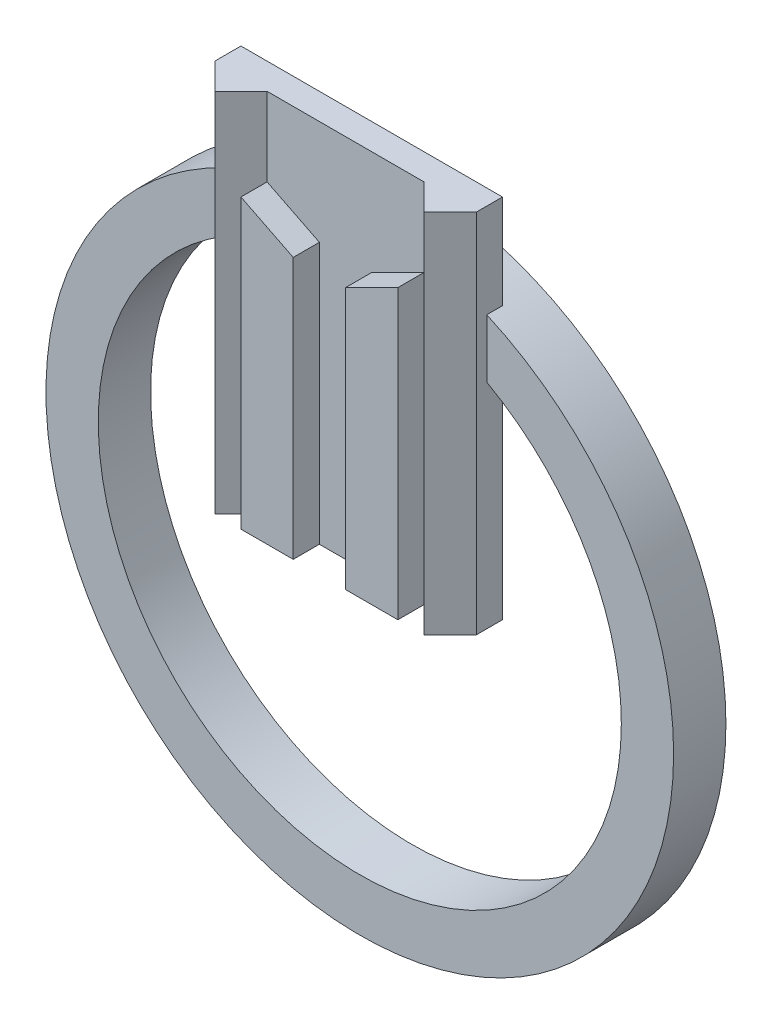
ISO-10303-21;
HEADER;
FILE_DESCRIPTION(('STEP AP214'),'2;1');
FILE_NAME('part.step','',(''),(''),'','','');
FILE_SCHEMA(('AUTOMOTIVE_DESIGN { 1 0 10303 214 1 1 1 1 }'));
ENDSEC;
DATA;
#1=APPLICATION_CONTEXT('core data for automotive mechanical design processes');
#2=APPLICATION_PROTOCOL_DEFINITION('international standard','automotive_design',2000,#1);
#3=PRODUCT_CONTEXT('',#1,'mechanical');
#4=PRODUCT('Part','Part','',(#3));
#5=PRODUCT_RELATED_PRODUCT_CATEGORY('part','',(#4));
#6=PRODUCT_DEFINITION_FORMATION('','',#4);
#7=PRODUCT_DEFINITION_CONTEXT('part definition',#1,'design');
#8=PRODUCT_DEFINITION('design','',#6,#7);
#9=PRODUCT_DEFINITION_SHAPE('','',#8);
#10=(LENGTH_UNIT() NAMED_UNIT(*) SI_UNIT(.MILLI.,.METRE.));
#11=(NAMED_UNIT(*) PLANE_ANGLE_UNIT() SI_UNIT($,.RADIAN.));
#12=(NAMED_UNIT(*) SI_UNIT($,.STERADIAN.) SOLID_ANGLE_UNIT());
#13=UNCERTAINTY_MEASURE_WITH_UNIT(LENGTH_MEASURE(1.E-05),#10,'distance_accuracy_value','');
#14=(GEOMETRIC_REPRESENTATION_CONTEXT(3) GLOBAL_UNCERTAINTY_ASSIGNED_CONTEXT((#13)) GLOBAL_UNIT_ASSIGNED_CONTEXT((#10,
#11,#12)) REPRESENTATION_CONTEXT('',''));
#15=CARTESIAN_POINT('',(0.,0.,0.));
#16=DIRECTION('',(0.,0.,1.));
#17=DIRECTION('',(1.,0.,0.));
#18=AXIS2_PLACEMENT_3D('',#15,#16,#17);
#19=CARTESIAN_POINT('',(0.,0.,0.));
#20=DIRECTION('',(0.,0.,1.));
#21=DIRECTION('',(1.,0.,0.));
#22=AXIS2_PLACEMENT_3D('',#19,#20,#21);
#23=PLANE('',#22);
#24=CARTESIAN_POINT('',(0.724382211705635,-37.8670558698346,0.));
#25=DIRECTION('',(0.,0.,1.));
#26=DIRECTION('',(1.,0.,0.));
#27=AXIS2_PLACEMENT_3D('',#24,#25,#26);
#28=CIRCLE('',#27,50.);
#29=CARTESIAN_POINT('',(25.,5.84443439298587,0.));
#30=VERTEX_POINT('',#29);
#31=CARTESIAN_POINT('',(-25.,5.00783374898642,0.));
#32=VERTEX_POINT('',#31);
#33=EDGE_CURVE('E164',#30,#32,#28,.T.);
#34=ORIENTED_EDGE('',*,*,#33,.F.);
#35=DIRECTION('',(0.,1.,0.));
#36=VECTOR('',#35,1.);
#37=CARTESIAN_POINT('',(25.,35.,0.));
#38=LINE('',#37,#36);
#39=CARTESIAN_POINT('',(25.,-35.,0.));
#40=VERTEX_POINT('',#39);
#41=EDGE_CURVE('E231',#40,#30,#38,.T.);
#42=ORIENTED_EDGE('',*,*,#41,.F.);
#43=DIRECTION('',(1.,0.,0.));
#44=VECTOR('',#43,1.);
#45=CARTESIAN_POINT('',(-25.,-35.,0.));
#46=LINE('',#45,#44);
#47=CARTESIAN_POINT('',(-25.,-35.,0.));
#48=VERTEX_POINT('',#47);
#49=EDGE_CURVE('E166',#48,#40,#46,.T.);
#50=ORIENTED_EDGE('',*,*,#49,.F.);
#51=DIRECTION('',(0.,-1.,0.));
#52=VECTOR('',#51,1.);
#53=CARTESIAN_POINT('',(-25.,35.,0.));
#54=LINE('',#53,#52);
#55=EDGE_CURVE('E160',#32,#48,#54,.T.);
#56=ORIENTED_EDGE('',*,*,#55,.F.);
#57=EDGE_LOOP('',(#34,#42,#50,#56));
#58=FACE_BOUND('',#57,.T.);
#59=ADVANCED_FACE('F32',(#58),#23,.F.);
#60=CARTESIAN_POINT('',(0.,0.,5.));
#61=DIRECTION('',(0.,0.,1.));
#62=DIRECTION('',(1.,0.,0.));
#63=AXIS2_PLACEMENT_3D('',#60,#61,#62);
#64=PLANE('',#63);
#65=DIRECTION('',(0.,-1.,0.));
#66=VECTOR('',#65,1.);
#67=CARTESIAN_POINT('',(5.,-35.,5.));
#68=LINE('',#67,#66);
#69=CARTESIAN_POINT('',(5.,15.,5.));
#70=VERTEX_POINT('',#69);
#71=CARTESIAN_POINT('',(5.,-35.,5.));
#72=VERTEX_POINT('',#71);
#73=EDGE_CURVE('E281',#70,#72,#68,.T.);
#74=ORIENTED_EDGE('',*,*,#73,.F.);
#75=DIRECTION('',(-0.894427190999916,-0.447213595499958,0.));
#76=VECTOR('',#75,1.);
#77=CARTESIAN_POINT('',(5.,15.,5.));
#78=LINE('',#77,#76);
#79=CARTESIAN_POINT('',(15.,20.,5.));
#80=VERTEX_POINT('',#79);
#81=EDGE_CURVE('E283',#80,#70,#78,.T.);
#82=ORIENTED_EDGE('',*,*,#81,.F.);
#83=DIRECTION('',(0.,-1.,0.));
#84=VECTOR('',#83,1.);
#85=CARTESIAN_POINT('',(15.,35.,5.));
#86=LINE('',#85,#84);
#87=CARTESIAN_POINT('',(15.,35.,5.));
#88=VERTEX_POINT('',#87);
#89=EDGE_CURVE('E206',#88,#80,#86,.T.);
#90=ORIENTED_EDGE('',*,*,#89,.F.);
#91=DIRECTION('',(-1.,0.,0.));
#92=VECTOR('',#91,1.);
#93=CARTESIAN_POINT('',(-25.,35.,5.));
#94=LINE('',#93,#92);
#95=CARTESIAN_POINT('',(-15.,35.,5.));
#96=VERTEX_POINT('',#95);
#97=EDGE_CURVE('E227',#88,#96,#94,.T.);
#98=ORIENTED_EDGE('',*,*,#97,.T.);
#99=DIRECTION('',(0.,1.,0.));
#100=VECTOR('',#99,1.);
#101=CARTESIAN_POINT('',(-15.,35.,5.));
#102=LINE('',#101,#100);
#103=CARTESIAN_POINT('',(-15.,20.,5.));
#104=VERTEX_POINT('',#103);
#105=EDGE_CURVE('E241',#104,#96,#102,.T.);
#106=ORIENTED_EDGE('',*,*,#105,.F.);
#107=DIRECTION('',(-0.894427190999916,0.447213595499958,0.));
#108=VECTOR('',#107,1.);
#109=CARTESIAN_POINT('',(-4.99999999999999,15.,5.));
#110=LINE('',#109,#108);
#111=CARTESIAN_POINT('',(-4.99999999999999,15.,5.));
#112=VERTEX_POINT('',#111);
#113=EDGE_CURVE('E254',#112,#104,#110,.T.);
#114=ORIENTED_EDGE('',*,*,#113,.F.);
#115=DIRECTION('',(0.,1.,0.));
#116=VECTOR('',#115,1.);
#117=CARTESIAN_POINT('',(-4.99999999999999,-35.,5.));
#118=LINE('',#117,#116);
#119=CARTESIAN_POINT('',(-4.99999999999999,-35.,5.));
#120=VERTEX_POINT('',#119);
#121=EDGE_CURVE('E258',#120,#112,#118,.T.);
#122=ORIENTED_EDGE('',*,*,#121,.F.);
#123=DIRECTION('',(1.,0.,0.));
#124=VECTOR('',#123,1.);
#125=CARTESIAN_POINT('',(-25.,-35.,5.));
#126=LINE('',#125,#124);
#127=EDGE_CURVE('E226',#120,#72,#126,.T.);
#128=ORIENTED_EDGE('',*,*,#127,.T.);
#129=EDGE_LOOP('',(#74,#82,#90,#98,#106,#114,#122,#128));
#130=FACE_BOUND('',#129,.T.);
#131=ADVANCED_FACE('F350',(#130),#64,.T.);
#132=CARTESIAN_POINT('',(25.,35.,5.));
#133=DIRECTION('',(-1.,0.,0.));
#134=DIRECTION('',(0.,-1.,0.));
#135=AXIS2_PLACEMENT_3D('',#132,#133,#134);
#136=PLANE('',#135);
#137=DIRECTION('',(0.,1.,0.));
#138=VECTOR('',#137,1.);
#139=CARTESIAN_POINT('',(25.,35.,3.));
#140=LINE('',#139,#138);
#141=CARTESIAN_POINT('',(25.,5.84443439298587,3.));
#142=VERTEX_POINT('',#141);
#143=CARTESIAN_POINT('',(25.,17.0027389265436,3.));
#144=VERTEX_POINT('',#143);
#145=EDGE_CURVE('E47',#142,#144,#140,.T.);
#146=ORIENTED_EDGE('',*,*,#145,.T.);
#147=DIRECTION('',(0.,0.,1.));
#148=VECTOR('',#147,1.);
#149=CARTESIAN_POINT('',(25.,17.0027389265436,-7.));
#150=LINE('',#149,#148);
#151=CARTESIAN_POINT('',(25.,17.0027389265436,0.));
#152=VERTEX_POINT('',#151);
#153=EDGE_CURVE('E294',#144,#152,#150,.F.);
#154=ORIENTED_EDGE('',*,*,#153,.T.);
#155=CARTESIAN_POINT('',(25.,35.,0.));
#156=VERTEX_POINT('',#155);
#157=EDGE_CURVE('E233',#152,#156,#38,.T.);
#158=ORIENTED_EDGE('',*,*,#157,.T.);
#159=DIRECTION('',(0.,0.,-1.));
#160=VECTOR('',#159,1.);
#161=CARTESIAN_POINT('',(25.,35.,5.));
#162=LINE('',#161,#160);
#163=CARTESIAN_POINT('',(25.,35.,4.99999999999996));
#164=VERTEX_POINT('',#163);
#165=EDGE_CURVE('E217',#164,#156,#162,.T.);
#166=ORIENTED_EDGE('',*,*,#165,.F.);
#167=DIRECTION('',(0.,-1.,0.));
#168=VECTOR('',#167,1.);
#169=CARTESIAN_POINT('',(25.,35.,4.99999999999996));
#170=LINE('',#169,#168);
#171=CARTESIAN_POINT('',(25.,-35.,4.99999999999996));
#172=VERTEX_POINT('',#171);
#173=EDGE_CURVE('E196',#164,#172,#170,.T.);
#174=ORIENTED_EDGE('',*,*,#173,.T.);
#175=DIRECTION('',(0.,0.,-1.));
#176=VECTOR('',#175,1.);
#177=CARTESIAN_POINT('',(25.,-35.,5.));
#178=LINE('',#177,#176);
#179=EDGE_CURVE('E224',#172,#40,#178,.T.);
#180=ORIENTED_EDGE('',*,*,#179,.T.);
#181=ORIENTED_EDGE('',*,*,#41,.T.);
#182=DIRECTION('',(0.,0.,1.));
#183=VECTOR('',#182,1.);
#184=CARTESIAN_POINT('',(25.,5.84443439298587,-7.));
#185=LINE('',#184,#183);
#186=EDGE_CURVE('E52',#142,#30,#185,.F.);
#187=ORIENTED_EDGE('',*,*,#186,.F.);
#188=EDGE_LOOP('',(#146,#154,#158,#166,#174,#180,#181,#187));
#189=FACE_BOUND('',#188,.T.);
#190=ADVANCED_FACE('F316',(#189),#136,.F.);
#191=CARTESIAN_POINT('',(-25.,35.,5.));
#192=DIRECTION('',(0.,-1.,0.));
#193=DIRECTION('',(0.,0.,-1.));
#194=AXIS2_PLACEMENT_3D('',#191,#192,#193);
#195=PLANE('',#194);
#196=DIRECTION('',(-0.707106781186546,0.,-0.707106781186549));
#197=VECTOR('',#196,1.);
#198=CARTESIAN_POINT('',(25.,35.,15.));
#199=LINE('',#198,#197);
#200=CARTESIAN_POINT('',(20.,35.,9.99999999999998));
#201=VERTEX_POINT('',#200);
#202=EDGE_CURVE('E201',#88,#201,#199,.F.);
#203=ORIENTED_EDGE('',*,*,#202,.T.);
#204=DIRECTION('',(-0.707106781186546,0.,0.707106781186549));
#205=VECTOR('',#204,1.);
#206=CARTESIAN_POINT('',(15.,35.,15.));
#207=LINE('',#206,#205);
#208=EDGE_CURVE('E199',#201,#164,#207,.F.);
#209=ORIENTED_EDGE('',*,*,#208,.T.);
#210=ORIENTED_EDGE('',*,*,#165,.T.);
#211=DIRECTION('',(-1.,0.,0.));
#212=VECTOR('',#211,1.);
#213=CARTESIAN_POINT('',(-25.,35.,0.));
#214=LINE('',#213,#212);
#215=CARTESIAN_POINT('',(-25.,35.,0.));
#216=VERTEX_POINT('',#215);
#217=EDGE_CURVE('E171',#156,#216,#214,.T.);
#218=ORIENTED_EDGE('',*,*,#217,.T.);
#219=DIRECTION('',(0.,0.,-1.));
#220=VECTOR('',#219,1.);
#221=CARTESIAN_POINT('',(-25.,35.,5.));
#222=LINE('',#221,#220);
#223=CARTESIAN_POINT('',(-25.,35.,4.99999999999997));
#224=VERTEX_POINT('',#223);
#225=EDGE_CURVE('E220',#224,#216,#222,.T.);
#226=ORIENTED_EDGE('',*,*,#225,.F.);
#227=DIRECTION('',(0.707106781186546,0.,0.707106781186549));
#228=VECTOR('',#227,1.);
#229=CARTESIAN_POINT('',(-15.,35.,15.));
#230=LINE('',#229,#228);
#231=CARTESIAN_POINT('',(-20.,35.,9.99999999999998));
#232=VERTEX_POINT('',#231);
#233=EDGE_CURVE('E215',#224,#232,#230,.T.);
#234=ORIENTED_EDGE('',*,*,#233,.T.);
#235=DIRECTION('',(0.707106781186546,0.,-0.707106781186549));
#236=VECTOR('',#235,1.);
#237=CARTESIAN_POINT('',(-25.,35.,15.));
#238=LINE('',#237,#236);
#239=EDGE_CURVE('E212',#232,#96,#238,.T.);
#240=ORIENTED_EDGE('',*,*,#239,.T.);
#241=ORIENTED_EDGE('',*,*,#97,.F.);
#242=EDGE_LOOP('',(#203,#209,#210,#218,#226,#234,#240,#241));
#243=FACE_BOUND('',#242,.T.);
#244=ADVANCED_FACE('F324',(#243),#195,.F.);
#245=CARTESIAN_POINT('',(-25.,35.,5.));
#246=DIRECTION('',(1.,0.,0.));
#247=DIRECTION('',(0.,1.,0.));
#248=AXIS2_PLACEMENT_3D('',#245,#246,#247);
#249=PLANE('',#248);
#250=CARTESIAN_POINT('',(-25.,16.3386279633769,0.));
#251=VERTEX_POINT('',#250);
#252=EDGE_CURVE('E170',#216,#251,#54,.T.);
#253=ORIENTED_EDGE('',*,*,#252,.T.);
#254=DIRECTION('',(0.,0.,1.));
#255=VECTOR('',#254,1.);
#256=CARTESIAN_POINT('',(-25.,16.3386279633769,-7.));
#257=LINE('',#256,#255);
#258=CARTESIAN_POINT('',(-25.,16.3386279633769,3.));
#259=VERTEX_POINT('',#258);
#260=EDGE_CURVE('E296',#251,#259,#257,.T.);
#261=ORIENTED_EDGE('',*,*,#260,.T.);
#262=DIRECTION('',(0.,-1.,0.));
#263=VECTOR('',#262,1.);
#264=CARTESIAN_POINT('',(-25.,35.,3.));
#265=LINE('',#264,#263);
#266=CARTESIAN_POINT('',(-25.,5.00783374898642,3.));
#267=VERTEX_POINT('',#266);
#268=EDGE_CURVE('E11',#259,#267,#265,.T.);
#269=ORIENTED_EDGE('',*,*,#268,.T.);
#270=DIRECTION('',(0.,0.,1.));
#271=VECTOR('',#270,1.);
#272=CARTESIAN_POINT('',(-25.,5.00783374898642,-7.));
#273=LINE('',#272,#271);
#274=EDGE_CURVE('E174',#32,#267,#273,.T.);
#275=ORIENTED_EDGE('',*,*,#274,.F.);
#276=ORIENTED_EDGE('',*,*,#55,.T.);
#277=DIRECTION('',(0.,0.,-1.));
#278=VECTOR('',#277,1.);
#279=CARTESIAN_POINT('',(-25.,-35.,5.));
#280=LINE('',#279,#278);
#281=CARTESIAN_POINT('',(-25.,-35.,4.99999999999997));
#282=VERTEX_POINT('',#281);
#283=EDGE_CURVE('E222',#282,#48,#280,.T.);
#284=ORIENTED_EDGE('',*,*,#283,.F.);
#285=DIRECTION('',(0.,1.,0.));
#286=VECTOR('',#285,1.);
#287=CARTESIAN_POINT('',(-25.,35.,4.99999999999997));
#288=LINE('',#287,#286);
#289=EDGE_CURVE('E203',#282,#224,#288,.T.);
#290=ORIENTED_EDGE('',*,*,#289,.T.);
#291=ORIENTED_EDGE('',*,*,#225,.T.);
#292=EDGE_LOOP('',(#253,#261,#269,#275,#276,#284,#290,#291));
#293=FACE_BOUND('',#292,.T.);
#294=ADVANCED_FACE('F176',(#293),#249,.F.);
#295=CARTESIAN_POINT('',(-25.,-35.,5.));
#296=DIRECTION('',(0.,1.,0.));
#297=DIRECTION('',(0.,0.,1.));
#298=AXIS2_PLACEMENT_3D('',#295,#296,#297);
#299=PLANE('',#298);
#300=ORIENTED_EDGE('',*,*,#179,.F.);
#301=DIRECTION('',(0.707106781186546,0.,-0.707106781186549));
#302=VECTOR('',#301,1.);
#303=CARTESIAN_POINT('',(15.,-35.,15.));
#304=LINE('',#303,#302);
#305=CARTESIAN_POINT('',(20.,-35.,9.99999999999998));
#306=VERTEX_POINT('',#305);
#307=EDGE_CURVE('E184',#172,#306,#304,.F.);
#308=ORIENTED_EDGE('',*,*,#307,.T.);
#309=DIRECTION('',(0.707106781186546,0.,0.707106781186549));
#310=VECTOR('',#309,1.);
#311=CARTESIAN_POINT('',(25.,-35.,15.));
#312=LINE('',#311,#310);
#313=CARTESIAN_POINT('',(15.,-35.,5.));
#314=VERTEX_POINT('',#313);
#315=EDGE_CURVE('E186',#306,#314,#312,.F.);
#316=ORIENTED_EDGE('',*,*,#315,.T.);
#317=DIRECTION('',(0.,0.,-1.));
#318=VECTOR('',#317,1.);
#319=CARTESIAN_POINT('',(15.,-35.,10.));
#320=LINE('',#319,#318);
#321=CARTESIAN_POINT('',(15.,-35.,10.));
#322=VERTEX_POINT('',#321);
#323=EDGE_CURVE('E272',#322,#314,#320,.T.);
#324=ORIENTED_EDGE('',*,*,#323,.F.);
#325=DIRECTION('',(1.,0.,0.));
#326=VECTOR('',#325,1.);
#327=CARTESIAN_POINT('',(15.,-35.,10.));
#328=LINE('',#327,#326);
#329=CARTESIAN_POINT('',(5.,-35.,10.));
#330=VERTEX_POINT('',#329);
#331=EDGE_CURVE('E287',#330,#322,#328,.T.);
#332=ORIENTED_EDGE('',*,*,#331,.F.);
#333=DIRECTION('',(0.,0.,-1.));
#334=VECTOR('',#333,1.);
#335=CARTESIAN_POINT('',(5.,-35.,10.));
#336=LINE('',#335,#334);
#337=EDGE_CURVE('E269',#330,#72,#336,.T.);
#338=ORIENTED_EDGE('',*,*,#337,.T.);
#339=ORIENTED_EDGE('',*,*,#127,.F.);
#340=DIRECTION('',(0.,0.,-1.));
#341=VECTOR('',#340,1.);
#342=CARTESIAN_POINT('',(-4.99999999999999,-35.,10.));
#343=LINE('',#342,#341);
#344=CARTESIAN_POINT('',(-4.99999999999999,-35.,10.));
#345=VERTEX_POINT('',#344);
#346=EDGE_CURVE('E192',#345,#120,#343,.T.);
#347=ORIENTED_EDGE('',*,*,#346,.F.);
#348=DIRECTION('',(1.,0.,0.));
#349=VECTOR('',#348,1.);
#350=CARTESIAN_POINT('',(-15.,-35.,10.));
#351=LINE('',#350,#349);
#352=CARTESIAN_POINT('',(-15.,-35.,10.));
#353=VERTEX_POINT('',#352);
#354=EDGE_CURVE('E257',#353,#345,#351,.T.);
#355=ORIENTED_EDGE('',*,*,#354,.F.);
#356=DIRECTION('',(0.,0.,-1.));
#357=VECTOR('',#356,1.);
#358=CARTESIAN_POINT('',(-15.,-35.,10.));
#359=LINE('',#358,#357);
#360=CARTESIAN_POINT('',(-15.,-35.,5.));
#361=VERTEX_POINT('',#360);
#362=EDGE_CURVE('E250',#353,#361,#359,.T.);
#363=ORIENTED_EDGE('',*,*,#362,.T.);
#364=DIRECTION('',(-0.707106781186546,0.,0.707106781186549));
#365=VECTOR('',#364,1.);
#366=CARTESIAN_POINT('',(-25.,-35.,15.));
#367=LINE('',#366,#365);
#368=CARTESIAN_POINT('',(-20.,-35.,9.99999999999998));
#369=VERTEX_POINT('',#368);
#370=EDGE_CURVE('E208',#361,#369,#367,.T.);
#371=ORIENTED_EDGE('',*,*,#370,.T.);
#372=DIRECTION('',(-0.707106781186546,0.,-0.707106781186549));
#373=VECTOR('',#372,1.);
#374=CARTESIAN_POINT('',(-15.,-35.,15.));
#375=LINE('',#374,#373);
#376=EDGE_CURVE('E210',#369,#282,#375,.T.);
#377=ORIENTED_EDGE('',*,*,#376,.T.);
#378=ORIENTED_EDGE('',*,*,#283,.T.);
#379=ORIENTED_EDGE('',*,*,#49,.T.);
#380=EDGE_LOOP('',(#300,#308,#316,#324,#332,#338,#339,#347,#355,#363,#371,#377,#378,#379));
#381=FACE_BOUND('',#380,.T.);
#382=ADVANCED_FACE('F334',(#381),#299,.F.);
#383=ORIENTED_EDGE('',*,*,#157,.F.);
#384=CARTESIAN_POINT('',(0.724382211705635,-37.8670558698346,0.));
#385=DIRECTION('',(0.,0.,1.));
#386=DIRECTION('',(1.,0.,0.));
#387=AXIS2_PLACEMENT_3D('',#384,#385,#386);
#388=CIRCLE('',#387,60.);
#389=EDGE_CURVE('E40',#152,#251,#388,.T.);
#390=ORIENTED_EDGE('',*,*,#389,.T.);
#391=ORIENTED_EDGE('',*,*,#252,.F.);
#392=ORIENTED_EDGE('',*,*,#217,.F.);
#393=EDGE_LOOP('',(#383,#390,#391,#392));
#394=FACE_BOUND('',#393,.T.);
#395=ADVANCED_FACE('F320',(#394),#23,.F.);
#396=CARTESIAN_POINT('',(-15.,0.,15.));
#397=DIRECTION('',(-0.707106781186549,0.,0.707106781186546));
#398=DIRECTION('',(0.,1.,0.));
#399=AXIS2_PLACEMENT_3D('',#396,#397,#398);
#400=PLANE('',#399);
#401=ORIENTED_EDGE('',*,*,#289,.F.);
#402=ORIENTED_EDGE('',*,*,#376,.F.);
#403=DIRECTION('',(0.,-1.,0.));
#404=VECTOR('',#403,1.);
#405=CARTESIAN_POINT('',(-20.,0.,9.99999999999998));
#406=LINE('',#405,#404);
#407=EDGE_CURVE('E191',#232,#369,#406,.T.);
#408=ORIENTED_EDGE('',*,*,#407,.F.);
#409=ORIENTED_EDGE('',*,*,#233,.F.);
#410=EDGE_LOOP('',(#401,#402,#408,#409));
#411=FACE_BOUND('',#410,.T.);
#412=ADVANCED_FACE('F378',(#411),#400,.T.);
#413=CARTESIAN_POINT('',(-25.,0.,15.));
#414=DIRECTION('',(0.707106781186549,0.,0.707106781186546));
#415=DIRECTION('',(0.,-1.,0.));
#416=AXIS2_PLACEMENT_3D('',#413,#414,#415);
#417=PLANE('',#416);
#418=ORIENTED_EDGE('',*,*,#370,.F.);
#419=EDGE_CURVE('E238',#361,#104,#102,.T.);
#420=ORIENTED_EDGE('',*,*,#419,.T.);
#421=ORIENTED_EDGE('',*,*,#105,.T.);
#422=ORIENTED_EDGE('',*,*,#239,.F.);
#423=ORIENTED_EDGE('',*,*,#407,.T.);
#424=EDGE_LOOP('',(#418,#420,#421,#422,#423));
#425=FACE_BOUND('',#424,.T.);
#426=ADVANCED_FACE('F383',(#425),#417,.T.);
#427=CARTESIAN_POINT('',(25.,0.,15.));
#428=DIRECTION('',(0.707106781186549,0.,-0.707106781186546));
#429=DIRECTION('',(0.,-1.,0.));
#430=AXIS2_PLACEMENT_3D('',#427,#428,#429);
#431=PLANE('',#430);
#432=ORIENTED_EDGE('',*,*,#89,.T.);
#433=DIRECTION('',(0.,1.,0.));
#434=VECTOR('',#433,1.);
#435=CARTESIAN_POINT('',(15.,20.,5.));
#436=LINE('',#435,#434);
#437=EDGE_CURVE('E278',#314,#80,#436,.T.);
#438=ORIENTED_EDGE('',*,*,#437,.F.);
#439=ORIENTED_EDGE('',*,*,#315,.F.);
#440=DIRECTION('',(0.,-1.,0.));
#441=VECTOR('',#440,1.);
#442=CARTESIAN_POINT('',(20.,0.,9.99999999999998));
#443=LINE('',#442,#441);
#444=EDGE_CURVE('E189',#201,#306,#443,.T.);
#445=ORIENTED_EDGE('',*,*,#444,.F.);
#446=ORIENTED_EDGE('',*,*,#202,.F.);
#447=EDGE_LOOP('',(#432,#438,#439,#445,#446));
#448=FACE_BOUND('',#447,.T.);
#449=ADVANCED_FACE('F34',(#448),#431,.F.);
#450=CARTESIAN_POINT('',(15.,0.,15.));
#451=DIRECTION('',(-0.707106781186549,0.,-0.707106781186546));
#452=DIRECTION('',(0.,1.,0.));
#453=AXIS2_PLACEMENT_3D('',#450,#451,#452);
#454=PLANE('',#453);
#455=ORIENTED_EDGE('',*,*,#307,.F.);
#456=ORIENTED_EDGE('',*,*,#173,.F.);
#457=ORIENTED_EDGE('',*,*,#208,.F.);
#458=ORIENTED_EDGE('',*,*,#444,.T.);
#459=EDGE_LOOP('',(#455,#456,#457,#458));
#460=FACE_BOUND('',#459,.T.);
#461=ADVANCED_FACE('F330',(#460),#454,.F.);
#462=CARTESIAN_POINT('',(-4.99999999999999,-35.,10.));
#463=DIRECTION('',(-1.,0.,0.));
#464=DIRECTION('',(0.,0.,1.));
#465=AXIS2_PLACEMENT_3D('',#462,#463,#464);
#466=PLANE('',#465);
#467=ORIENTED_EDGE('',*,*,#121,.T.);
#468=DIRECTION('',(0.,0.,-1.));
#469=VECTOR('',#468,1.);
#470=CARTESIAN_POINT('',(-4.99999999999999,15.,10.));
#471=LINE('',#470,#469);
#472=CARTESIAN_POINT('',(-4.99999999999999,15.,10.));
#473=VERTEX_POINT('',#472);
#474=EDGE_CURVE('E245',#473,#112,#471,.T.);
#475=ORIENTED_EDGE('',*,*,#474,.F.);
#476=DIRECTION('',(0.,1.,0.));
#477=VECTOR('',#476,1.);
#478=CARTESIAN_POINT('',(-4.99999999999999,-35.,10.));
#479=LINE('',#478,#477);
#480=EDGE_CURVE('E264',#345,#473,#479,.T.);
#481=ORIENTED_EDGE('',*,*,#480,.F.);
#482=ORIENTED_EDGE('',*,*,#346,.T.);
#483=EDGE_LOOP('',(#467,#475,#481,#482));
#484=FACE_BOUND('',#483,.T.);
#485=ADVANCED_FACE('F398',(#484),#466,.F.);
#486=CARTESIAN_POINT('',(-4.99999999999999,15.,10.));
#487=DIRECTION('',(-0.447213595499958,-0.894427190999916,0.));
#488=DIRECTION('',(0.894427190999916,-0.447213595499958,0.));
#489=AXIS2_PLACEMENT_3D('',#486,#487,#488);
#490=PLANE('',#489);
#491=ORIENTED_EDGE('',*,*,#113,.T.);
#492=DIRECTION('',(0.,0.,-1.));
#493=VECTOR('',#492,1.);
#494=CARTESIAN_POINT('',(-15.,20.,10.));
#495=LINE('',#494,#493);
#496=CARTESIAN_POINT('',(-15.,20.,10.));
#497=VERTEX_POINT('',#496);
#498=EDGE_CURVE('E248',#497,#104,#495,.T.);
#499=ORIENTED_EDGE('',*,*,#498,.F.);
#500=DIRECTION('',(-0.894427190999916,0.447213595499958,0.));
#501=VECTOR('',#500,1.);
#502=CARTESIAN_POINT('',(-4.99999999999999,15.,10.));
#503=LINE('',#502,#501);
#504=EDGE_CURVE('E262',#473,#497,#503,.T.);
#505=ORIENTED_EDGE('',*,*,#504,.F.);
#506=ORIENTED_EDGE('',*,*,#474,.T.);
#507=EDGE_LOOP('',(#491,#499,#505,#506));
#508=FACE_BOUND('',#507,.T.);
#509=ADVANCED_FACE('F403',(#508),#490,.F.);
#510=CARTESIAN_POINT('',(-15.,20.,10.));
#511=DIRECTION('',(1.,0.,0.));
#512=DIRECTION('',(0.,0.,-1.));
#513=AXIS2_PLACEMENT_3D('',#510,#511,#512);
#514=PLANE('',#513);
#515=ORIENTED_EDGE('',*,*,#419,.F.);
#516=ORIENTED_EDGE('',*,*,#362,.F.);
#517=DIRECTION('',(0.,-1.,0.));
#518=VECTOR('',#517,1.);
#519=CARTESIAN_POINT('',(-15.,20.,10.));
#520=LINE('',#519,#518);
#521=EDGE_CURVE('E253',#497,#353,#520,.T.);
#522=ORIENTED_EDGE('',*,*,#521,.F.);
#523=ORIENTED_EDGE('',*,*,#498,.T.);
#524=EDGE_LOOP('',(#515,#516,#522,#523));
#525=FACE_BOUND('',#524,.T.);
#526=ADVANCED_FACE('F457',(#525),#514,.F.);
#527=CARTESIAN_POINT('',(0.,0.,10.));
#528=DIRECTION('',(0.,0.,1.));
#529=DIRECTION('',(1.,0.,0.));
#530=AXIS2_PLACEMENT_3D('',#527,#528,#529);
#531=PLANE('',#530);
#532=ORIENTED_EDGE('',*,*,#354,.T.);
#533=ORIENTED_EDGE('',*,*,#480,.T.);
#534=ORIENTED_EDGE('',*,*,#504,.T.);
#535=ORIENTED_EDGE('',*,*,#521,.T.);
#536=EDGE_LOOP('',(#532,#533,#534,#535));
#537=FACE_BOUND('',#536,.T.);
#538=ADVANCED_FACE('F466',(#537),#531,.T.);
#539=CARTESIAN_POINT('',(5.,15.,10.));
#540=DIRECTION('',(0.447213595499958,-0.894427190999916,0.));
#541=DIRECTION('',(0.894427190999916,0.447213595499958,0.));
#542=AXIS2_PLACEMENT_3D('',#539,#540,#541);
#543=PLANE('',#542);
#544=ORIENTED_EDGE('',*,*,#81,.T.);
#545=DIRECTION('',(0.,0.,-1.));
#546=VECTOR('',#545,1.);
#547=CARTESIAN_POINT('',(5.,15.,10.));
#548=LINE('',#547,#546);
#549=CARTESIAN_POINT('',(5.,15.,10.));
#550=VERTEX_POINT('',#549);
#551=EDGE_CURVE('E260',#550,#70,#548,.T.);
#552=ORIENTED_EDGE('',*,*,#551,.F.);
#553=DIRECTION('',(-0.894427190999916,-0.447213595499958,0.));
#554=VECTOR('',#553,1.);
#555=CARTESIAN_POINT('',(5.,15.,10.));
#556=LINE('',#555,#554);
#557=CARTESIAN_POINT('',(15.,20.,10.));
#558=VERTEX_POINT('',#557);
#559=EDGE_CURVE('E280',#558,#550,#556,.T.);
#560=ORIENTED_EDGE('',*,*,#559,.F.);
#561=DIRECTION('',(0.,0.,-1.));
#562=VECTOR('',#561,1.);
#563=CARTESIAN_POINT('',(15.,20.,10.));
#564=LINE('',#563,#562);
#565=EDGE_CURVE('E274',#558,#80,#564,.T.);
#566=ORIENTED_EDGE('',*,*,#565,.T.);
#567=EDGE_LOOP('',(#544,#552,#560,#566));
#568=FACE_BOUND('',#567,.T.);
#569=ADVANCED_FACE('F346',(#568),#543,.F.);
#570=CARTESIAN_POINT('',(5.,-35.,10.));
#571=DIRECTION('',(1.,0.,0.));
#572=DIRECTION('',(0.,0.,-1.));
#573=AXIS2_PLACEMENT_3D('',#570,#571,#572);
#574=PLANE('',#573);
#575=ORIENTED_EDGE('',*,*,#73,.T.);
#576=ORIENTED_EDGE('',*,*,#337,.F.);
#577=DIRECTION('',(0.,-1.,0.));
#578=VECTOR('',#577,1.);
#579=CARTESIAN_POINT('',(5.,-35.,10.));
#580=LINE('',#579,#578);
#581=EDGE_CURVE('E289',#550,#330,#580,.T.);
#582=ORIENTED_EDGE('',*,*,#581,.F.);
#583=ORIENTED_EDGE('',*,*,#551,.T.);
#584=EDGE_LOOP('',(#575,#576,#582,#583));
#585=FACE_BOUND('',#584,.T.);
#586=ADVANCED_FACE('F356',(#585),#574,.F.);
#587=CARTESIAN_POINT('',(15.,20.,10.));
#588=DIRECTION('',(-1.,0.,0.));
#589=DIRECTION('',(0.,-1.,0.));
#590=AXIS2_PLACEMENT_3D('',#587,#588,#589);
#591=PLANE('',#590);
#592=ORIENTED_EDGE('',*,*,#437,.T.);
#593=ORIENTED_EDGE('',*,*,#565,.F.);
#594=DIRECTION('',(0.,1.,0.));
#595=VECTOR('',#594,1.);
#596=CARTESIAN_POINT('',(15.,20.,10.));
#597=LINE('',#596,#595);
#598=EDGE_CURVE('E277',#322,#558,#597,.T.);
#599=ORIENTED_EDGE('',*,*,#598,.F.);
#600=ORIENTED_EDGE('',*,*,#323,.T.);
#601=EDGE_LOOP('',(#592,#593,#599,#600));
#602=FACE_BOUND('',#601,.T.);
#603=ADVANCED_FACE('F341',(#602),#591,.F.);
#604=CARTESIAN_POINT('',(0.,0.,10.));
#605=DIRECTION('',(0.,0.,-1.));
#606=DIRECTION('',(-1.,0.,0.));
#607=AXIS2_PLACEMENT_3D('',#604,#605,#606);
#608=PLANE('',#607);
#609=ORIENTED_EDGE('',*,*,#559,.T.);
#610=ORIENTED_EDGE('',*,*,#581,.T.);
#611=ORIENTED_EDGE('',*,*,#331,.T.);
#612=ORIENTED_EDGE('',*,*,#598,.T.);
#613=EDGE_LOOP('',(#609,#610,#611,#612));
#614=FACE_BOUND('',#613,.T.);
#615=ADVANCED_FACE('F360',(#614),#608,.F.);
#616=CARTESIAN_POINT('',(0.724382211705635,-37.8670558698346,3.));
#617=DIRECTION('',(0.,0.,1.));
#618=DIRECTION('',(1.,0.,0.));
#619=AXIS2_PLACEMENT_3D('',#616,#617,#618);
#620=PLANE('',#619);
#621=ORIENTED_EDGE('',*,*,#145,.F.);
#622=CARTESIAN_POINT('',(0.724382211705635,-37.8670558698346,3.));
#623=DIRECTION('',(0.,0.,1.));
#624=DIRECTION('',(1.,0.,0.));
#625=AXIS2_PLACEMENT_3D('',#622,#623,#624);
#626=CIRCLE('',#625,50.);
#627=EDGE_CURVE('E307',#267,#142,#626,.T.);
#628=ORIENTED_EDGE('',*,*,#627,.F.);
#629=ORIENTED_EDGE('',*,*,#268,.F.);
#630=CARTESIAN_POINT('',(0.724382211705635,-37.8670558698346,3.));
#631=DIRECTION('',(0.,0.,1.));
#632=DIRECTION('',(1.,0.,0.));
#633=AXIS2_PLACEMENT_3D('',#630,#631,#632);
#634=CIRCLE('',#633,60.);
#635=EDGE_CURVE('E304',#259,#144,#634,.T.);
#636=ORIENTED_EDGE('',*,*,#635,.T.);
#637=EDGE_LOOP('',(#621,#628,#629,#636));
#638=FACE_BOUND('',#637,.T.);
#639=ADVANCED_FACE('F309',(#638),#620,.T.);
#640=CARTESIAN_POINT('',(0.724382211705635,-37.8670558698346,-7.));
#641=DIRECTION('',(0.,0.,1.));
#642=DIRECTION('',(1.,0.,0.));
#643=AXIS2_PLACEMENT_3D('',#640,#641,#642);
#644=CYLINDRICAL_SURFACE('',#643,60.);
#645=CARTESIAN_POINT('',(0.724382211705635,-37.8670558698346,-7.));
#646=DIRECTION('',(0.,0.,1.));
#647=DIRECTION('',(1.,0.,0.));
#648=AXIS2_PLACEMENT_3D('',#645,#646,#647);
#649=CIRCLE('',#648,60.);
#650=CARTESIAN_POINT('',(60.7243822117056,-37.8670558698346,-7.));
#651=VERTEX_POINT('',#650);
#652=EDGE_CURVE('E181',#651,#651,#649,.T.);
#653=ORIENTED_EDGE('',*,*,#652,.T.);
#654=EDGE_LOOP('',(#653));
#655=FACE_BOUND('',#654,.T.);
#656=ORIENTED_EDGE('',*,*,#153,.F.);
#657=ORIENTED_EDGE('',*,*,#635,.F.);
#658=ORIENTED_EDGE('',*,*,#260,.F.);
#659=ORIENTED_EDGE('',*,*,#389,.F.);
#660=EDGE_LOOP('',(#656,#657,#658,#659));
#661=FACE_BOUND('',#660,.T.);
#662=ADVANCED_FACE('F313',(#655,#661),#644,.T.);
#663=CARTESIAN_POINT('',(0.724382211705635,-37.8670558698346,-7.));
#664=DIRECTION('',(0.,0.,1.));
#665=DIRECTION('',(1.,0.,0.));
#666=AXIS2_PLACEMENT_3D('',#663,#664,#665);
#667=CYLINDRICAL_SURFACE('',#666,50.);
#668=CARTESIAN_POINT('',(0.724382211705635,-37.8670558698346,-7.));
#669=DIRECTION('',(0.,0.,1.));
#670=DIRECTION('',(1.,0.,0.));
#671=AXIS2_PLACEMENT_3D('',#668,#669,#670);
#672=CIRCLE('',#671,50.);
#673=CARTESIAN_POINT('',(50.7243822117056,-37.8670558698346,-7.));
#674=VERTEX_POINT('',#673);
#675=EDGE_CURVE('E301',#674,#674,#672,.T.);
#676=ORIENTED_EDGE('',*,*,#675,.F.);
#677=EDGE_LOOP('',(#676));
#678=FACE_BOUND('',#677,.T.);
#679=ORIENTED_EDGE('',*,*,#627,.T.);
#680=ORIENTED_EDGE('',*,*,#186,.T.);
#681=ORIENTED_EDGE('',*,*,#33,.T.);
#682=ORIENTED_EDGE('',*,*,#274,.T.);
#683=EDGE_LOOP('',(#679,#680,#681,#682));
#684=FACE_BOUND('',#683,.T.);
#685=ADVANCED_FACE('F183',(#678,#684),#667,.F.);
#686=CARTESIAN_POINT('',(0.724382211705635,-37.8670558698346,-7.));
#687=DIRECTION('',(0.,0.,1.));
#688=DIRECTION('',(1.,0.,0.));
#689=AXIS2_PLACEMENT_3D('',#686,#687,#688);
#690=PLANE('',#689);
#691=ORIENTED_EDGE('',*,*,#675,.T.);
#692=EDGE_LOOP('',(#691));
#693=FACE_BOUND('',#692,.T.);
#694=ORIENTED_EDGE('',*,*,#652,.F.);
#695=EDGE_LOOP('',(#694));
#696=FACE_BOUND('',#695,.T.);
#697=ADVANCED_FACE('F523',(#693,#696),#690,.F.);
#698=CLOSED_SHELL('',(#59,#131,#190,#244,#294,#382,#395,#412,#426,#449,#461,#485,#509,#526,#538,
#569,#586,#603,#615,#639,#662,#685,#697));
#699=MANIFOLD_SOLID_BREP('B2',#698);
#700=ADVANCED_BREP_SHAPE_REPRESENTATION('',(#18,#699),#14);
#701=SHAPE_DEFINITION_REPRESENTATION(#9,#700);
ENDSEC;
END-ISO-10303-21;
